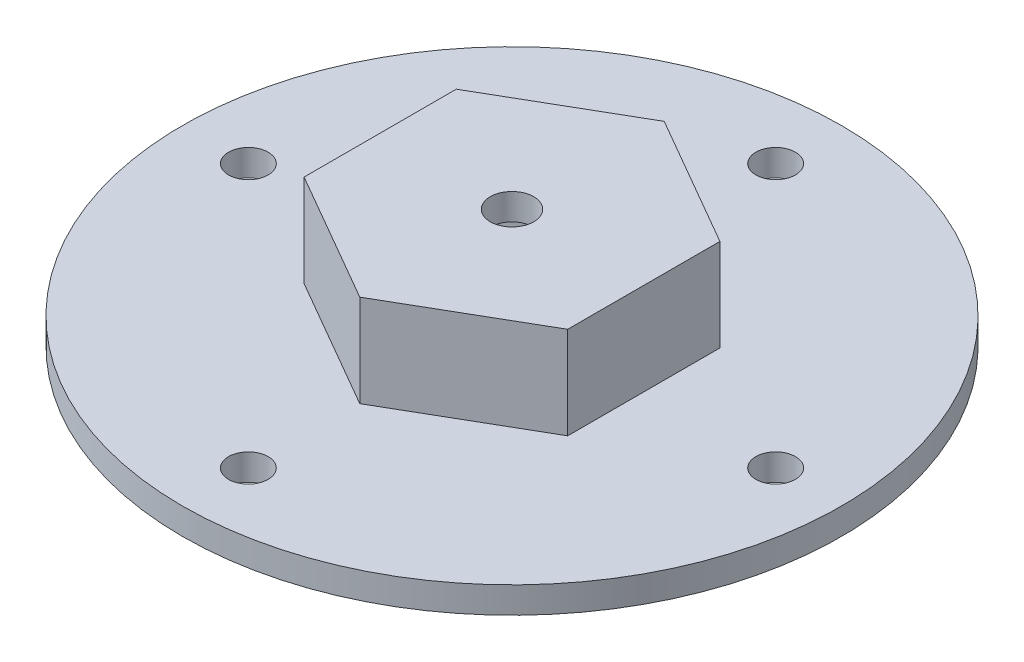
ISO-10303-21;
HEADER;
FILE_DESCRIPTION(('STEP AP214'),'2;1');
FILE_NAME('part.step','',(''),(''),'','','');
FILE_SCHEMA(('AUTOMOTIVE_DESIGN { 1 0 10303 214 1 1 1 1 }'));
ENDSEC;
DATA;
#1=APPLICATION_CONTEXT('core data for automotive mechanical design processes');
#2=APPLICATION_PROTOCOL_DEFINITION('international standard','automotive_design',2000,#1);
#3=PRODUCT_CONTEXT('',#1,'mechanical');
#4=PRODUCT('Part','Part','',(#3));
#5=PRODUCT_RELATED_PRODUCT_CATEGORY('part','',(#4));
#6=PRODUCT_DEFINITION_FORMATION('','',#4);
#7=PRODUCT_DEFINITION_CONTEXT('part definition',#1,'design');
#8=PRODUCT_DEFINITION('design','',#6,#7);
#9=PRODUCT_DEFINITION_SHAPE('','',#8);
#10=(LENGTH_UNIT() NAMED_UNIT(*) SI_UNIT(.MILLI.,.METRE.));
#11=(NAMED_UNIT(*) PLANE_ANGLE_UNIT() SI_UNIT($,.RADIAN.));
#12=(NAMED_UNIT(*) SI_UNIT($,.STERADIAN.) SOLID_ANGLE_UNIT());
#13=UNCERTAINTY_MEASURE_WITH_UNIT(LENGTH_MEASURE(1.E-05),#10,'distance_accuracy_value','');
#14=(GEOMETRIC_REPRESENTATION_CONTEXT(3) GLOBAL_UNCERTAINTY_ASSIGNED_CONTEXT((#13)) GLOBAL_UNIT_ASSIGNED_CONTEXT((#10,
#11,#12)) REPRESENTATION_CONTEXT('',''));
#15=CARTESIAN_POINT('',(0.,0.,0.));
#16=DIRECTION('',(0.,0.,1.));
#17=DIRECTION('',(1.,0.,0.));
#18=AXIS2_PLACEMENT_3D('',#15,#16,#17);
#19=CARTESIAN_POINT('',(-10.,9.,-5.77350269189625));
#20=DIRECTION('',(1.,0.,0.));
#21=DIRECTION('',(0.,0.,-1.));
#22=AXIS2_PLACEMENT_3D('',#19,#20,#21);
#23=PLANE('',#22);
#24=DIRECTION('',(0.,0.,1.));
#25=VECTOR('',#24,1.);
#26=CARTESIAN_POINT('',(-10.,2.,-5.77350269189625));
#27=LINE('',#26,#25);
#28=CARTESIAN_POINT('',(-10.,2.,-5.77350269189625));
#29=VERTEX_POINT('',#28);
#30=CARTESIAN_POINT('',(-10.,2.,5.77350269189626));
#31=VERTEX_POINT('',#30);
#32=EDGE_CURVE('E208',#29,#31,#27,.T.);
#33=ORIENTED_EDGE('',*,*,#32,.T.);
#34=DIRECTION('',(0.,-1.,0.));
#35=VECTOR('',#34,1.);
#36=CARTESIAN_POINT('',(-10.,9.,5.77350269189626));
#37=LINE('',#36,#35);
#38=CARTESIAN_POINT('',(-10.,9.,5.77350269189626));
#39=VERTEX_POINT('',#38);
#40=EDGE_CURVE('E221',#39,#31,#37,.T.);
#41=ORIENTED_EDGE('',*,*,#40,.F.);
#42=DIRECTION('',(0.,0.,1.));
#43=VECTOR('',#42,1.);
#44=CARTESIAN_POINT('',(-10.,9.,-5.77350269189625));
#45=LINE('',#44,#43);
#46=CARTESIAN_POINT('',(-10.,9.,-5.77350269189625));
#47=VERTEX_POINT('',#46);
#48=EDGE_CURVE('E195',#47,#39,#45,.T.);
#49=ORIENTED_EDGE('',*,*,#48,.F.);
#50=DIRECTION('',(0.,-1.,0.));
#51=VECTOR('',#50,1.);
#52=CARTESIAN_POINT('',(-10.,9.,-5.77350269189625));
#53=LINE('',#52,#51);
#54=EDGE_CURVE('E224',#47,#29,#53,.T.);
#55=ORIENTED_EDGE('',*,*,#54,.T.);
#56=EDGE_LOOP('',(#33,#41,#49,#55));
#57=FACE_BOUND('',#56,.T.);
#58=CARTESIAN_POINT('',(-10.,5.,0.));
#59=DIRECTION('',(-1.,0.,0.));
#60=DIRECTION('',(0.,0.,1.));
#61=AXIS2_PLACEMENT_3D('',#58,#59,#60);
#62=CIRCLE('',#61,1.64999999999999);
#63=CARTESIAN_POINT('',(-10.,5.,1.64999999999999));
#64=VERTEX_POINT('',#63);
#65=EDGE_CURVE('E362',#64,#64,#62,.T.);
#66=ORIENTED_EDGE('',*,*,#65,.F.);
#67=EDGE_LOOP('',(#66));
#68=FACE_BOUND('',#67,.T.);
#69=ADVANCED_FACE('F39',(#57,#68),#23,.F.);
#70=CARTESIAN_POINT('',(0.,2.,0.));
#71=DIRECTION('',(0.,1.,0.));
#72=DIRECTION('',(0.,0.,1.));
#73=AXIS2_PLACEMENT_3D('',#70,#71,#72);
#74=PLANE('',#73);
#75=CARTESIAN_POINT('',(0.,2.,-20.));
#76=DIRECTION('',(0.,1.,0.));
#77=DIRECTION('',(0.,0.,1.));
#78=AXIS2_PLACEMENT_3D('',#75,#76,#77);
#79=CIRCLE('',#78,1.5);
#80=CARTESIAN_POINT('',(0.,2.,-18.5));
#81=VERTEX_POINT('',#80);
#82=EDGE_CURVE('E230',#81,#81,#79,.T.);
#83=ORIENTED_EDGE('',*,*,#82,.F.);
#84=EDGE_LOOP('',(#83));
#85=FACE_BOUND('',#84,.T.);
#86=CARTESIAN_POINT('',(20.0000000000006,2.,-5.64760248210638E-13));
#87=DIRECTION('',(0.,1.,0.));
#88=DIRECTION('',(0.,0.,1.));
#89=AXIS2_PLACEMENT_3D('',#86,#87,#88);
#90=CIRCLE('',#89,1.50000000000044);
#91=CARTESIAN_POINT('',(20.0000000000006,2.,1.49999999999988));
#92=VERTEX_POINT('',#91);
#93=EDGE_CURVE('E234',#92,#92,#90,.T.);
#94=ORIENTED_EDGE('',*,*,#93,.F.);
#95=EDGE_LOOP('',(#94));
#96=FACE_BOUND('',#95,.T.);
#97=CARTESIAN_POINT('',(1.12952049642128E-12,2.,20.));
#98=DIRECTION('',(0.,1.,0.));
#99=DIRECTION('',(0.,0.,1.));
#100=AXIS2_PLACEMENT_3D('',#97,#98,#99);
#101=CIRCLE('',#100,1.50000000000121);
#102=CARTESIAN_POINT('',(1.12952049642128E-12,2.,21.5000000000012));
#103=VERTEX_POINT('',#102);
#104=EDGE_CURVE('E237',#103,#103,#101,.T.);
#105=ORIENTED_EDGE('',*,*,#104,.F.);
#106=EDGE_LOOP('',(#105));
#107=FACE_BOUND('',#106,.T.);
#108=CARTESIAN_POINT('',(-19.9999999999994,2.,5.67209541808933E-13));
#109=DIRECTION('',(0.,1.,0.));
#110=DIRECTION('',(0.,0.,1.));
#111=AXIS2_PLACEMENT_3D('',#108,#109,#110);
#112=CIRCLE('',#111,1.50000000000091);
#113=CARTESIAN_POINT('',(-19.9999999999994,2.,1.50000000000147));
#114=VERTEX_POINT('',#113);
#115=EDGE_CURVE('E229',#114,#114,#112,.T.);
#116=ORIENTED_EDGE('',*,*,#115,.F.);
#117=EDGE_LOOP('',(#116));
#118=FACE_BOUND('',#117,.T.);
#119=CARTESIAN_POINT('',(0.,2.,0.));
#120=DIRECTION('',(0.,1.,0.));
#121=DIRECTION('',(0.,0.,1.));
#122=AXIS2_PLACEMENT_3D('',#119,#120,#121);
#123=CIRCLE('',#122,25.);
#124=CARTESIAN_POINT('',(0.,2.,25.));
#125=VERTEX_POINT('',#124);
#126=EDGE_CURVE('E11',#125,#125,#123,.T.);
#127=ORIENTED_EDGE('',*,*,#126,.T.);
#128=EDGE_LOOP('',(#127));
#129=FACE_BOUND('',#128,.T.);
#130=DIRECTION('',(-0.866025403784438,0.,0.5));
#131=VECTOR('',#130,1.);
#132=CARTESIAN_POINT('',(0.,2.,-11.5470053837925));
#133=LINE('',#132,#131);
#134=CARTESIAN_POINT('',(0.,2.,-11.5470053837925));
#135=VERTEX_POINT('',#134);
#136=EDGE_CURVE('E206',#135,#29,#133,.T.);
#137=ORIENTED_EDGE('',*,*,#136,.F.);
#138=DIRECTION('',(-0.866025403784439,0.,-0.5));
#139=VECTOR('',#138,1.);
#140=CARTESIAN_POINT('',(10.,2.,-5.77350269189626));
#141=LINE('',#140,#139);
#142=CARTESIAN_POINT('',(10.,2.,-5.77350269189626));
#143=VERTEX_POINT('',#142);
#144=EDGE_CURVE('E181',#143,#135,#141,.T.);
#145=ORIENTED_EDGE('',*,*,#144,.F.);
#146=DIRECTION('',(0.,0.,-1.));
#147=VECTOR('',#146,1.);
#148=CARTESIAN_POINT('',(10.,2.,5.77350269189626));
#149=LINE('',#148,#147);
#150=CARTESIAN_POINT('',(10.,2.,5.77350269189626));
#151=VERTEX_POINT('',#150);
#152=EDGE_CURVE('E193',#151,#143,#149,.T.);
#153=ORIENTED_EDGE('',*,*,#152,.F.);
#154=DIRECTION('',(0.866025403784439,0.,-0.5));
#155=VECTOR('',#154,1.);
#156=CARTESIAN_POINT('',(0.,2.,11.5470053837925));
#157=LINE('',#156,#155);
#158=CARTESIAN_POINT('',(0.,2.,11.5470053837925));
#159=VERTEX_POINT('',#158);
#160=EDGE_CURVE('E212',#159,#151,#157,.T.);
#161=ORIENTED_EDGE('',*,*,#160,.F.);
#162=DIRECTION('',(0.866025403784439,0.,0.5));
#163=VECTOR('',#162,1.);
#164=CARTESIAN_POINT('',(-10.,2.,5.77350269189626));
#165=LINE('',#164,#163);
#166=EDGE_CURVE('E210',#31,#159,#165,.T.);
#167=ORIENTED_EDGE('',*,*,#166,.F.);
#168=ORIENTED_EDGE('',*,*,#32,.F.);
#169=EDGE_LOOP('',(#137,#145,#153,#161,#167,#168));
#170=FACE_BOUND('',#169,.T.);
#171=ADVANCED_FACE('F274',(#85,#96,#107,#118,#129,#170),#74,.T.);
#172=CARTESIAN_POINT('',(0.,2.,0.));
#173=DIRECTION('',(0.,-1.,0.));
#174=DIRECTION('',(0.,0.,-1.));
#175=AXIS2_PLACEMENT_3D('',#172,#173,#174);
#176=CYLINDRICAL_SURFACE('',#175,25.);
#177=ORIENTED_EDGE('',*,*,#126,.F.);
#178=EDGE_LOOP('',(#177));
#179=FACE_BOUND('',#178,.T.);
#180=CARTESIAN_POINT('',(0.,0.,0.));
#181=DIRECTION('',(0.,1.,0.));
#182=DIRECTION('',(0.,0.,1.));
#183=AXIS2_PLACEMENT_3D('',#180,#181,#182);
#184=CIRCLE('',#183,25.);
#185=CARTESIAN_POINT('',(0.,0.,25.));
#186=VERTEX_POINT('',#185);
#187=EDGE_CURVE('E48',#186,#186,#184,.T.);
#188=ORIENTED_EDGE('',*,*,#187,.T.);
#189=EDGE_LOOP('',(#188));
#190=FACE_BOUND('',#189,.T.);
#191=ADVANCED_FACE('F41',(#179,#190),#176,.T.);
#192=CARTESIAN_POINT('',(0.,0.,0.));
#193=DIRECTION('',(0.,1.,0.));
#194=DIRECTION('',(0.,0.,1.));
#195=AXIS2_PLACEMENT_3D('',#192,#193,#194);
#196=PLANE('',#195);
#197=DIRECTION('',(-0.866025403784439,0.,-0.5));
#198=VECTOR('',#197,1.);
#199=CARTESIAN_POINT('',(0.,0.,5.77350269189626));
#200=LINE('',#199,#198);
#201=CARTESIAN_POINT('',(0.,0.,5.77350269189626));
#202=VERTEX_POINT('',#201);
#203=CARTESIAN_POINT('',(-5.,0.,2.88675134594813));
#204=VERTEX_POINT('',#203);
#205=EDGE_CURVE('E169',#202,#204,#200,.T.);
#206=ORIENTED_EDGE('',*,*,#205,.F.);
#207=DIRECTION('',(-0.866025403784438,0.,0.5));
#208=VECTOR('',#207,1.);
#209=CARTESIAN_POINT('',(5.,0.,2.88675134594813));
#210=LINE('',#209,#208);
#211=CARTESIAN_POINT('',(5.,0.,2.88675134594813));
#212=VERTEX_POINT('',#211);
#213=EDGE_CURVE('E56',#212,#202,#210,.T.);
#214=ORIENTED_EDGE('',*,*,#213,.F.);
#215=DIRECTION('',(0.,0.,1.));
#216=VECTOR('',#215,1.);
#217=CARTESIAN_POINT('',(5.,0.,-2.88675134594813));
#218=LINE('',#217,#216);
#219=CARTESIAN_POINT('',(5.,0.,-2.88675134594813));
#220=VERTEX_POINT('',#219);
#221=EDGE_CURVE('E152',#220,#212,#218,.T.);
#222=ORIENTED_EDGE('',*,*,#221,.F.);
#223=DIRECTION('',(0.866025403784438,0.,0.5));
#224=VECTOR('',#223,1.);
#225=CARTESIAN_POINT('',(0.,0.,-5.77350269189626));
#226=LINE('',#225,#224);
#227=CARTESIAN_POINT('',(0.,0.,-5.77350269189626));
#228=VERTEX_POINT('',#227);
#229=EDGE_CURVE('E155',#228,#220,#226,.T.);
#230=ORIENTED_EDGE('',*,*,#229,.F.);
#231=DIRECTION('',(0.866025403784439,0.,-0.5));
#232=VECTOR('',#231,1.);
#233=CARTESIAN_POINT('',(-5.,0.,-2.88675134594813));
#234=LINE('',#233,#232);
#235=CARTESIAN_POINT('',(-5.,0.,-2.88675134594813));
#236=VERTEX_POINT('',#235);
#237=EDGE_CURVE('E174',#236,#228,#234,.T.);
#238=ORIENTED_EDGE('',*,*,#237,.F.);
#239=DIRECTION('',(0.,0.,-1.));
#240=VECTOR('',#239,1.);
#241=CARTESIAN_POINT('',(-5.,0.,2.88675134594813));
#242=LINE('',#241,#240);
#243=EDGE_CURVE('E171',#204,#236,#242,.T.);
#244=ORIENTED_EDGE('',*,*,#243,.F.);
#245=EDGE_LOOP('',(#206,#214,#222,#230,#238,#244));
#246=FACE_BOUND('',#245,.T.);
#247=CARTESIAN_POINT('',(0.,0.,-20.));
#248=DIRECTION('',(0.,1.,0.));
#249=DIRECTION('',(0.,0.,1.));
#250=AXIS2_PLACEMENT_3D('',#247,#248,#249);
#251=CIRCLE('',#250,1.5);
#252=CARTESIAN_POINT('',(0.,0.,-18.5));
#253=VERTEX_POINT('',#252);
#254=EDGE_CURVE('E43',#253,#253,#251,.T.);
#255=ORIENTED_EDGE('',*,*,#254,.T.);
#256=EDGE_LOOP('',(#255));
#257=FACE_BOUND('',#256,.T.);
#258=CARTESIAN_POINT('',(20.0000000000006,0.,-5.64760248210638E-13));
#259=DIRECTION('',(0.,1.,0.));
#260=DIRECTION('',(0.,0.,1.));
#261=AXIS2_PLACEMENT_3D('',#258,#259,#260);
#262=CIRCLE('',#261,1.50000000000044);
#263=CARTESIAN_POINT('',(20.0000000000006,0.,1.49999999999988));
#264=VERTEX_POINT('',#263);
#265=EDGE_CURVE('E248',#264,#264,#262,.T.);
#266=ORIENTED_EDGE('',*,*,#265,.T.);
#267=EDGE_LOOP('',(#266));
#268=FACE_BOUND('',#267,.T.);
#269=CARTESIAN_POINT('',(1.12952049642128E-12,0.,20.));
#270=DIRECTION('',(0.,1.,0.));
#271=DIRECTION('',(0.,0.,1.));
#272=AXIS2_PLACEMENT_3D('',#269,#270,#271);
#273=CIRCLE('',#272,1.50000000000121);
#274=CARTESIAN_POINT('',(1.12952049642128E-12,0.,21.5000000000012));
#275=VERTEX_POINT('',#274);
#276=EDGE_CURVE('E246',#275,#275,#273,.T.);
#277=ORIENTED_EDGE('',*,*,#276,.T.);
#278=EDGE_LOOP('',(#277));
#279=FACE_BOUND('',#278,.T.);
#280=CARTESIAN_POINT('',(-19.9999999999994,0.,5.67209541808933E-13));
#281=DIRECTION('',(0.,1.,0.));
#282=DIRECTION('',(0.,0.,1.));
#283=AXIS2_PLACEMENT_3D('',#280,#281,#282);
#284=CIRCLE('',#283,1.50000000000091);
#285=CARTESIAN_POINT('',(-19.9999999999994,0.,1.50000000000147));
#286=VERTEX_POINT('',#285);
#287=EDGE_CURVE('E233',#286,#286,#284,.T.);
#288=ORIENTED_EDGE('',*,*,#287,.T.);
#289=EDGE_LOOP('',(#288));
#290=FACE_BOUND('',#289,.T.);
#291=ORIENTED_EDGE('',*,*,#187,.F.);
#292=EDGE_LOOP('',(#291));
#293=FACE_BOUND('',#292,.T.);
#294=ADVANCED_FACE('F255',(#246,#257,#268,#279,#290,#293),#196,.F.);
#295=CARTESIAN_POINT('',(-19.9999999999994,-1.,5.67209541808933E-13));
#296=DIRECTION('',(0.,1.,0.));
#297=DIRECTION('',(0.,0.,1.));
#298=AXIS2_PLACEMENT_3D('',#295,#296,#297);
#299=CYLINDRICAL_SURFACE('',#298,1.50000000000091);
#300=ORIENTED_EDGE('',*,*,#115,.T.);
#301=EDGE_LOOP('',(#300));
#302=FACE_BOUND('',#301,.T.);
#303=ORIENTED_EDGE('',*,*,#287,.F.);
#304=EDGE_LOOP('',(#303));
#305=FACE_BOUND('',#304,.T.);
#306=ADVANCED_FACE('F379',(#302,#305),#299,.F.);
#307=CARTESIAN_POINT('',(1.12952049642128E-12,-1.,20.));
#308=DIRECTION('',(0.,1.,0.));
#309=DIRECTION('',(0.,0.,1.));
#310=AXIS2_PLACEMENT_3D('',#307,#308,#309);
#311=CYLINDRICAL_SURFACE('',#310,1.50000000000121);
#312=ORIENTED_EDGE('',*,*,#104,.T.);
#313=EDGE_LOOP('',(#312));
#314=FACE_BOUND('',#313,.T.);
#315=ORIENTED_EDGE('',*,*,#276,.F.);
#316=EDGE_LOOP('',(#315));
#317=FACE_BOUND('',#316,.T.);
#318=ADVANCED_FACE('F270',(#314,#317),#311,.F.);
#319=CARTESIAN_POINT('',(20.0000000000006,-1.,-5.64760248210638E-13));
#320=DIRECTION('',(0.,1.,0.));
#321=DIRECTION('',(0.,0.,1.));
#322=AXIS2_PLACEMENT_3D('',#319,#320,#321);
#323=CYLINDRICAL_SURFACE('',#322,1.50000000000044);
#324=ORIENTED_EDGE('',*,*,#93,.T.);
#325=EDGE_LOOP('',(#324));
#326=FACE_BOUND('',#325,.T.);
#327=ORIENTED_EDGE('',*,*,#265,.F.);
#328=EDGE_LOOP('',(#327));
#329=FACE_BOUND('',#328,.T.);
#330=ADVANCED_FACE('F260',(#326,#329),#323,.F.);
#331=CARTESIAN_POINT('',(0.,-1.,-20.));
#332=DIRECTION('',(0.,1.,0.));
#333=DIRECTION('',(0.,0.,1.));
#334=AXIS2_PLACEMENT_3D('',#331,#332,#333);
#335=CYLINDRICAL_SURFACE('',#334,1.5);
#336=ORIENTED_EDGE('',*,*,#82,.T.);
#337=EDGE_LOOP('',(#336));
#338=FACE_BOUND('',#337,.T.);
#339=ORIENTED_EDGE('',*,*,#254,.F.);
#340=EDGE_LOOP('',(#339));
#341=FACE_BOUND('',#340,.T.);
#342=ADVANCED_FACE('F257',(#338,#341),#335,.F.);
#343=CARTESIAN_POINT('',(10.,9.,-5.77350269189626));
#344=DIRECTION('',(-0.5,0.,0.866025403784439));
#345=DIRECTION('',(0.866025403784439,0.,0.5));
#346=AXIS2_PLACEMENT_3D('',#343,#344,#345);
#347=PLANE('',#346);
#348=ORIENTED_EDGE('',*,*,#144,.T.);
#349=DIRECTION('',(0.,-1.,0.));
#350=VECTOR('',#349,1.);
#351=CARTESIAN_POINT('',(0.,9.,-11.5470053837925));
#352=LINE('',#351,#350);
#353=CARTESIAN_POINT('',(0.,9.,-11.5470053837925));
#354=VERTEX_POINT('',#353);
#355=EDGE_CURVE('E227',#354,#135,#352,.T.);
#356=ORIENTED_EDGE('',*,*,#355,.F.);
#357=DIRECTION('',(-0.866025403784439,0.,-0.5));
#358=VECTOR('',#357,1.);
#359=CARTESIAN_POINT('',(10.,9.,-5.77350269189626));
#360=LINE('',#359,#358);
#361=CARTESIAN_POINT('',(10.,9.,-5.77350269189626));
#362=VERTEX_POINT('',#361);
#363=EDGE_CURVE('E189',#362,#354,#360,.T.);
#364=ORIENTED_EDGE('',*,*,#363,.F.);
#365=DIRECTION('',(0.,-1.,0.));
#366=VECTOR('',#365,1.);
#367=CARTESIAN_POINT('',(10.,9.,-5.77350269189626));
#368=LINE('',#367,#366);
#369=EDGE_CURVE('E203',#362,#143,#368,.T.);
#370=ORIENTED_EDGE('',*,*,#369,.T.);
#371=EDGE_LOOP('',(#348,#356,#364,#370));
#372=FACE_BOUND('',#371,.T.);
#373=ADVANCED_FACE('F259',(#372),#347,.F.);
#374=CARTESIAN_POINT('',(0.,9.,-11.5470053837925));
#375=DIRECTION('',(0.5,0.,0.866025403784438));
#376=DIRECTION('',(0.866025403784439,0.,-0.5));
#377=AXIS2_PLACEMENT_3D('',#374,#375,#376);
#378=PLANE('',#377);
#379=ORIENTED_EDGE('',*,*,#136,.T.);
#380=ORIENTED_EDGE('',*,*,#54,.F.);
#381=DIRECTION('',(-0.866025403784438,0.,0.5));
#382=VECTOR('',#381,1.);
#383=CARTESIAN_POINT('',(0.,9.,-11.5470053837925));
#384=LINE('',#383,#382);
#385=EDGE_CURVE('E192',#354,#47,#384,.T.);
#386=ORIENTED_EDGE('',*,*,#385,.F.);
#387=ORIENTED_EDGE('',*,*,#355,.T.);
#388=EDGE_LOOP('',(#379,#380,#386,#387));
#389=FACE_BOUND('',#388,.T.);
#390=ADVANCED_FACE('F267',(#389),#378,.F.);
#391=CARTESIAN_POINT('',(-10.,9.,5.77350269189626));
#392=DIRECTION('',(0.5,0.,-0.866025403784439));
#393=DIRECTION('',(-0.866025403784439,0.,-0.5));
#394=AXIS2_PLACEMENT_3D('',#391,#392,#393);
#395=PLANE('',#394);
#396=ORIENTED_EDGE('',*,*,#166,.T.);
#397=DIRECTION('',(0.,-1.,0.));
#398=VECTOR('',#397,1.);
#399=CARTESIAN_POINT('',(0.,9.,11.5470053837925));
#400=LINE('',#399,#398);
#401=CARTESIAN_POINT('',(0.,9.,11.5470053837925));
#402=VERTEX_POINT('',#401);
#403=EDGE_CURVE('E218',#402,#159,#400,.T.);
#404=ORIENTED_EDGE('',*,*,#403,.F.);
#405=DIRECTION('',(0.866025403784439,0.,0.5));
#406=VECTOR('',#405,1.);
#407=CARTESIAN_POINT('',(-10.,9.,5.77350269189626));
#408=LINE('',#407,#406);
#409=EDGE_CURVE('E197',#39,#402,#408,.T.);
#410=ORIENTED_EDGE('',*,*,#409,.F.);
#411=ORIENTED_EDGE('',*,*,#40,.T.);
#412=EDGE_LOOP('',(#396,#404,#410,#411));
#413=FACE_BOUND('',#412,.T.);
#414=ADVANCED_FACE('F285',(#413),#395,.F.);
#415=CARTESIAN_POINT('',(0.,9.,11.5470053837925));
#416=DIRECTION('',(-0.5,0.,-0.866025403784439));
#417=DIRECTION('',(-0.866025403784439,0.,0.5));
#418=AXIS2_PLACEMENT_3D('',#415,#416,#417);
#419=PLANE('',#418);
#420=ORIENTED_EDGE('',*,*,#160,.T.);
#421=DIRECTION('',(0.,-1.,0.));
#422=VECTOR('',#421,1.);
#423=CARTESIAN_POINT('',(10.,9.,5.77350269189626));
#424=LINE('',#423,#422);
#425=CARTESIAN_POINT('',(10.,9.,5.77350269189626));
#426=VERTEX_POINT('',#425);
#427=EDGE_CURVE('E64',#426,#151,#424,.T.);
#428=ORIENTED_EDGE('',*,*,#427,.F.);
#429=DIRECTION('',(0.866025403784439,0.,-0.5));
#430=VECTOR('',#429,1.);
#431=CARTESIAN_POINT('',(0.,9.,11.5470053837925));
#432=LINE('',#431,#430);
#433=EDGE_CURVE('E199',#402,#426,#432,.T.);
#434=ORIENTED_EDGE('',*,*,#433,.F.);
#435=ORIENTED_EDGE('',*,*,#403,.T.);
#436=EDGE_LOOP('',(#420,#428,#434,#435));
#437=FACE_BOUND('',#436,.T.);
#438=ADVANCED_FACE('F292',(#437),#419,.F.);
#439=CARTESIAN_POINT('',(10.,9.,5.77350269189626));
#440=DIRECTION('',(-1.,0.,0.));
#441=DIRECTION('',(0.,0.,1.));
#442=AXIS2_PLACEMENT_3D('',#439,#440,#441);
#443=PLANE('',#442);
#444=ORIENTED_EDGE('',*,*,#152,.T.);
#445=ORIENTED_EDGE('',*,*,#369,.F.);
#446=DIRECTION('',(0.,0.,-1.));
#447=VECTOR('',#446,1.);
#448=CARTESIAN_POINT('',(10.,9.,5.77350269189626));
#449=LINE('',#448,#447);
#450=EDGE_CURVE('E201',#426,#362,#449,.T.);
#451=ORIENTED_EDGE('',*,*,#450,.F.);
#452=ORIENTED_EDGE('',*,*,#427,.T.);
#453=EDGE_LOOP('',(#444,#445,#451,#452));
#454=FACE_BOUND('',#453,.T.);
#455=ADVANCED_FACE('F313',(#454),#443,.F.);
#456=CARTESIAN_POINT('',(0.,9.,0.));
#457=DIRECTION('',(0.,1.,0.));
#458=DIRECTION('',(0.,0.,1.));
#459=AXIS2_PLACEMENT_3D('',#456,#457,#458);
#460=PLANE('',#459);
#461=CARTESIAN_POINT('',(0.,9.,0.));
#462=DIRECTION('',(0.,1.,0.));
#463=DIRECTION('',(0.,0.,1.));
#464=AXIS2_PLACEMENT_3D('',#461,#462,#463);
#465=CIRCLE('',#464,1.64999999999999);
#466=CARTESIAN_POINT('',(0.,9.,1.64999999999999));
#467=VERTEX_POINT('',#466);
#468=EDGE_CURVE('E358',#467,#467,#465,.T.);
#469=ORIENTED_EDGE('',*,*,#468,.F.);
#470=EDGE_LOOP('',(#469));
#471=FACE_BOUND('',#470,.T.);
#472=ORIENTED_EDGE('',*,*,#363,.T.);
#473=ORIENTED_EDGE('',*,*,#385,.T.);
#474=ORIENTED_EDGE('',*,*,#48,.T.);
#475=ORIENTED_EDGE('',*,*,#409,.T.);
#476=ORIENTED_EDGE('',*,*,#433,.T.);
#477=ORIENTED_EDGE('',*,*,#450,.T.);
#478=EDGE_LOOP('',(#472,#473,#474,#475,#476,#477));
#479=FACE_BOUND('',#478,.T.);
#480=ADVANCED_FACE('F310',(#471,#479),#460,.T.);
#481=CARTESIAN_POINT('',(5.,7.,2.88675134594813));
#482=DIRECTION('',(0.5,0.,0.866025403784438));
#483=DIRECTION('',(0.866025403784439,0.,-0.5));
#484=AXIS2_PLACEMENT_3D('',#481,#482,#483);
#485=PLANE('',#484);
#486=ORIENTED_EDGE('',*,*,#213,.T.);
#487=DIRECTION('',(0.,-1.,0.));
#488=VECTOR('',#487,1.);
#489=CARTESIAN_POINT('',(0.,7.,5.77350269189626));
#490=LINE('',#489,#488);
#491=CARTESIAN_POINT('',(0.,7.,5.77350269189626));
#492=VERTEX_POINT('',#491);
#493=EDGE_CURVE('E129',#492,#202,#490,.T.);
#494=ORIENTED_EDGE('',*,*,#493,.F.);
#495=DIRECTION('',(-0.866025403784438,0.,0.5));
#496=VECTOR('',#495,1.);
#497=CARTESIAN_POINT('',(5.,7.,2.88675134594813));
#498=LINE('',#497,#496);
#499=CARTESIAN_POINT('',(5.,7.,2.88675134594813));
#500=VERTEX_POINT('',#499);
#501=EDGE_CURVE('E133',#500,#492,#498,.T.);
#502=ORIENTED_EDGE('',*,*,#501,.F.);
#503=DIRECTION('',(0.,-1.,0.));
#504=VECTOR('',#503,1.);
#505=CARTESIAN_POINT('',(5.,7.,2.88675134594813));
#506=LINE('',#505,#504);
#507=EDGE_CURVE('E179',#500,#212,#506,.T.);
#508=ORIENTED_EDGE('',*,*,#507,.T.);
#509=EDGE_LOOP('',(#486,#494,#502,#508));
#510=FACE_BOUND('',#509,.T.);
#511=ADVANCED_FACE('F131',(#510),#485,.F.);
#512=CARTESIAN_POINT('',(5.,7.,-2.88675134594813));
#513=DIRECTION('',(1.,0.,0.));
#514=DIRECTION('',(0.,0.,-1.));
#515=AXIS2_PLACEMENT_3D('',#512,#513,#514);
#516=PLANE('',#515);
#517=ORIENTED_EDGE('',*,*,#221,.T.);
#518=ORIENTED_EDGE('',*,*,#507,.F.);
#519=DIRECTION('',(0.,0.,1.));
#520=VECTOR('',#519,1.);
#521=CARTESIAN_POINT('',(5.,7.,-2.88675134594813));
#522=LINE('',#521,#520);
#523=CARTESIAN_POINT('',(5.,7.,-2.88675134594813));
#524=VERTEX_POINT('',#523);
#525=EDGE_CURVE('E139',#524,#500,#522,.T.);
#526=ORIENTED_EDGE('',*,*,#525,.F.);
#527=DIRECTION('',(0.,-1.,0.));
#528=VECTOR('',#527,1.);
#529=CARTESIAN_POINT('',(5.,7.,-2.88675134594813));
#530=LINE('',#529,#528);
#531=EDGE_CURVE('E182',#524,#220,#530,.T.);
#532=ORIENTED_EDGE('',*,*,#531,.T.);
#533=EDGE_LOOP('',(#517,#518,#526,#532));
#534=FACE_BOUND('',#533,.T.);
#535=ADVANCED_FACE('F325',(#534),#516,.F.);
#536=CARTESIAN_POINT('',(0.,7.,-5.77350269189626));
#537=DIRECTION('',(0.5,0.,-0.866025403784438));
#538=DIRECTION('',(-0.866025403784439,0.,-0.5));
#539=AXIS2_PLACEMENT_3D('',#536,#537,#538);
#540=PLANE('',#539);
#541=ORIENTED_EDGE('',*,*,#229,.T.);
#542=ORIENTED_EDGE('',*,*,#531,.F.);
#543=DIRECTION('',(0.866025403784438,0.,0.5));
#544=VECTOR('',#543,1.);
#545=CARTESIAN_POINT('',(0.,7.,-5.77350269189626));
#546=LINE('',#545,#544);
#547=CARTESIAN_POINT('',(0.,7.,-5.77350269189626));
#548=VERTEX_POINT('',#547);
#549=EDGE_CURVE('E165',#548,#524,#546,.T.);
#550=ORIENTED_EDGE('',*,*,#549,.F.);
#551=DIRECTION('',(0.,-1.,0.));
#552=VECTOR('',#551,1.);
#553=CARTESIAN_POINT('',(0.,7.,-5.77350269189626));
#554=LINE('',#553,#552);
#555=EDGE_CURVE('E184',#548,#228,#554,.T.);
#556=ORIENTED_EDGE('',*,*,#555,.T.);
#557=EDGE_LOOP('',(#541,#542,#550,#556));
#558=FACE_BOUND('',#557,.T.);
#559=ADVANCED_FACE('F335',(#558),#540,.F.);
#560=CARTESIAN_POINT('',(-5.,7.,-2.88675134594813));
#561=DIRECTION('',(-0.5,0.,-0.866025403784439));
#562=DIRECTION('',(-0.866025403784439,0.,0.5));
#563=AXIS2_PLACEMENT_3D('',#560,#561,#562);
#564=PLANE('',#563);
#565=ORIENTED_EDGE('',*,*,#237,.T.);
#566=ORIENTED_EDGE('',*,*,#555,.F.);
#567=DIRECTION('',(0.866025403784439,0.,-0.5));
#568=VECTOR('',#567,1.);
#569=CARTESIAN_POINT('',(-5.,7.,-2.88675134594813));
#570=LINE('',#569,#568);
#571=CARTESIAN_POINT('',(-5.,7.,-2.88675134594813));
#572=VERTEX_POINT('',#571);
#573=EDGE_CURVE('E162',#572,#548,#570,.T.);
#574=ORIENTED_EDGE('',*,*,#573,.F.);
#575=DIRECTION('',(0.,-1.,0.));
#576=VECTOR('',#575,1.);
#577=CARTESIAN_POINT('',(-5.,7.,-2.88675134594813));
#578=LINE('',#577,#576);
#579=EDGE_CURVE('E186',#572,#236,#578,.T.);
#580=ORIENTED_EDGE('',*,*,#579,.T.);
#581=EDGE_LOOP('',(#565,#566,#574,#580));
#582=FACE_BOUND('',#581,.T.);
#583=ADVANCED_FACE('F331',(#582),#564,.F.);
#584=CARTESIAN_POINT('',(-5.,7.,2.88675134594813));
#585=DIRECTION('',(-1.,0.,0.));
#586=DIRECTION('',(0.,0.,1.));
#587=AXIS2_PLACEMENT_3D('',#584,#585,#586);
#588=PLANE('',#587);
#589=CARTESIAN_POINT('',(-5.,5.,0.));
#590=DIRECTION('',(-1.,0.,0.));
#591=DIRECTION('',(0.,0.,1.));
#592=AXIS2_PLACEMENT_3D('',#589,#590,#591);
#593=CIRCLE('',#592,1.64999999999999);
#594=CARTESIAN_POINT('',(-5.,5.,1.65));
#595=VERTEX_POINT('',#594);
#596=EDGE_CURVE('E158',#595,#595,#593,.T.);
#597=ORIENTED_EDGE('',*,*,#596,.T.);
#598=EDGE_LOOP('',(#597));
#599=FACE_BOUND('',#598,.T.);
#600=ORIENTED_EDGE('',*,*,#243,.T.);
#601=ORIENTED_EDGE('',*,*,#579,.F.);
#602=DIRECTION('',(0.,0.,-1.));
#603=VECTOR('',#602,1.);
#604=CARTESIAN_POINT('',(-5.,7.,2.88675134594813));
#605=LINE('',#604,#603);
#606=CARTESIAN_POINT('',(-5.,7.,2.88675134594813));
#607=VERTEX_POINT('',#606);
#608=EDGE_CURVE('E147',#607,#572,#605,.T.);
#609=ORIENTED_EDGE('',*,*,#608,.F.);
#610=DIRECTION('',(0.,-1.,0.));
#611=VECTOR('',#610,1.);
#612=CARTESIAN_POINT('',(-5.,7.,2.88675134594813));
#613=LINE('',#612,#611);
#614=EDGE_CURVE('E138',#607,#204,#613,.T.);
#615=ORIENTED_EDGE('',*,*,#614,.T.);
#616=EDGE_LOOP('',(#600,#601,#609,#615));
#617=FACE_BOUND('',#616,.T.);
#618=ADVANCED_FACE('F328',(#599,#617),#588,.F.);
#619=CARTESIAN_POINT('',(0.,7.,5.77350269189626));
#620=DIRECTION('',(-0.5,0.,0.866025403784439));
#621=DIRECTION('',(0.866025403784439,0.,0.5));
#622=AXIS2_PLACEMENT_3D('',#619,#620,#621);
#623=PLANE('',#622);
#624=ORIENTED_EDGE('',*,*,#205,.T.);
#625=ORIENTED_EDGE('',*,*,#614,.F.);
#626=DIRECTION('',(-0.866025403784439,0.,-0.5));
#627=VECTOR('',#626,1.);
#628=CARTESIAN_POINT('',(0.,7.,5.77350269189626));
#629=LINE('',#628,#627);
#630=EDGE_CURVE('E142',#492,#607,#629,.T.);
#631=ORIENTED_EDGE('',*,*,#630,.F.);
#632=ORIENTED_EDGE('',*,*,#493,.T.);
#633=EDGE_LOOP('',(#624,#625,#631,#632));
#634=FACE_BOUND('',#633,.T.);
#635=ADVANCED_FACE('F143',(#634),#623,.F.);
#636=CARTESIAN_POINT('',(0.,7.,0.));
#637=DIRECTION('',(0.,-1.,0.));
#638=DIRECTION('',(0.,0.,-1.));
#639=AXIS2_PLACEMENT_3D('',#636,#637,#638);
#640=PLANE('',#639);
#641=CARTESIAN_POINT('',(0.,7.,0.));
#642=DIRECTION('',(0.,-1.,0.));
#643=DIRECTION('',(0.,0.,-1.));
#644=AXIS2_PLACEMENT_3D('',#641,#642,#643);
#645=CIRCLE('',#644,1.64999999999999);
#646=CARTESIAN_POINT('',(0.,7.,-1.64999999999999));
#647=VERTEX_POINT('',#646);
#648=EDGE_CURVE('E361',#647,#647,#645,.T.);
#649=ORIENTED_EDGE('',*,*,#648,.F.);
#650=EDGE_LOOP('',(#649));
#651=FACE_BOUND('',#650,.T.);
#652=ORIENTED_EDGE('',*,*,#501,.T.);
#653=ORIENTED_EDGE('',*,*,#630,.T.);
#654=ORIENTED_EDGE('',*,*,#608,.T.);
#655=ORIENTED_EDGE('',*,*,#573,.T.);
#656=ORIENTED_EDGE('',*,*,#549,.T.);
#657=ORIENTED_EDGE('',*,*,#525,.T.);
#658=EDGE_LOOP('',(#652,#653,#654,#655,#656,#657));
#659=FACE_BOUND('',#658,.T.);
#660=ADVANCED_FACE('F149',(#651,#659),#640,.T.);
#661=CARTESIAN_POINT('',(-10.,5.,0.));
#662=DIRECTION('',(-1.,0.,0.));
#663=DIRECTION('',(0.,0.,1.));
#664=AXIS2_PLACEMENT_3D('',#661,#662,#663);
#665=CYLINDRICAL_SURFACE('',#664,1.64999999999999);
#666=ORIENTED_EDGE('',*,*,#596,.F.);
#667=EDGE_LOOP('',(#666));
#668=FACE_BOUND('',#667,.T.);
#669=ORIENTED_EDGE('',*,*,#65,.T.);
#670=EDGE_LOOP('',(#669));
#671=FACE_BOUND('',#670,.T.);
#672=ADVANCED_FACE('F345',(#668,#671),#665,.F.);
#673=CARTESIAN_POINT('',(0.,9.,0.));
#674=DIRECTION('',(0.,1.,0.));
#675=DIRECTION('',(0.,0.,1.));
#676=AXIS2_PLACEMENT_3D('',#673,#674,#675);
#677=CYLINDRICAL_SURFACE('',#676,1.64999999999999);
#678=ORIENTED_EDGE('',*,*,#468,.T.);
#679=EDGE_LOOP('',(#678));
#680=FACE_BOUND('',#679,.T.);
#681=ORIENTED_EDGE('',*,*,#648,.T.);
#682=EDGE_LOOP('',(#681));
#683=FACE_BOUND('',#682,.T.);
#684=ADVANCED_FACE('F349',(#680,#683),#677,.F.);
#685=CLOSED_SHELL('',(#69,#171,#191,#294,#306,#318,#330,#342,#373,#390,#414,#438,#455,#480,#511,
#535,#559,#583,#618,#635,#660,#672,#684));
#686=MANIFOLD_SOLID_BREP('B2',#685);
#687=ADVANCED_BREP_SHAPE_REPRESENTATION('',(#18,#686),#14);
#688=SHAPE_DEFINITION_REPRESENTATION(#9,#687);
ENDSEC;
END-ISO-10303-21;
